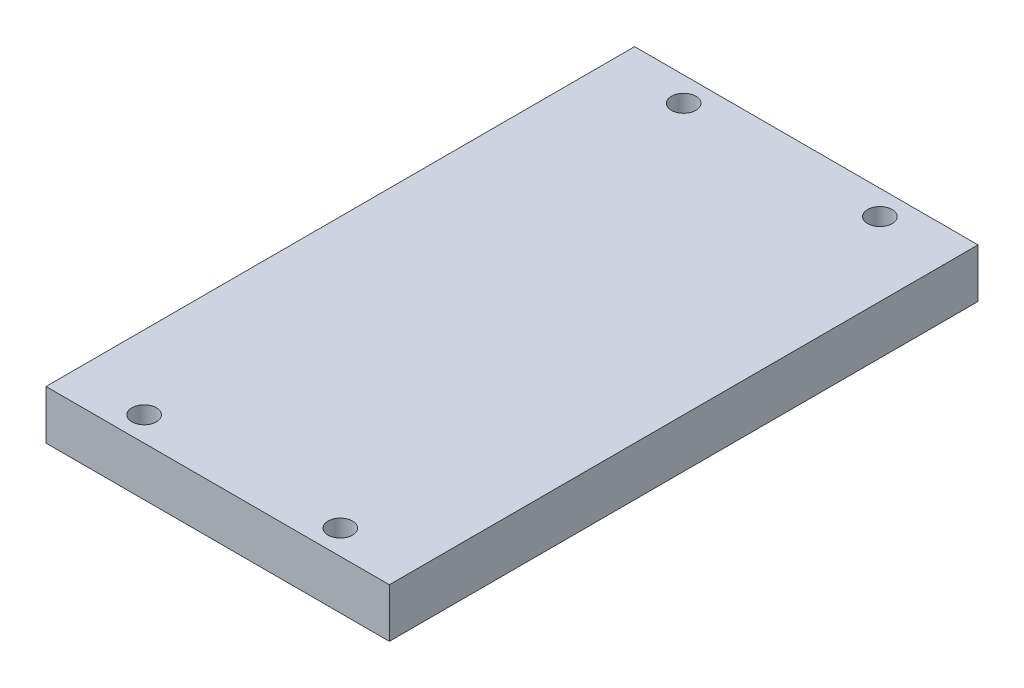
ISO-10303-21;
HEADER;
FILE_DESCRIPTION(('STEP AP214'),'2;1');
FILE_NAME('part.step','',(''),(''),'','','');
FILE_SCHEMA(('AUTOMOTIVE_DESIGN { 1 0 10303 214 1 1 1 1 }'));
ENDSEC;
DATA;
#1=APPLICATION_CONTEXT('core data for automotive mechanical design processes');
#2=APPLICATION_PROTOCOL_DEFINITION('international standard','automotive_design',2000,#1);
#3=PRODUCT_CONTEXT('',#1,'mechanical');
#4=PRODUCT('Part','Part','',(#3));
#5=PRODUCT_RELATED_PRODUCT_CATEGORY('part','',(#4));
#6=PRODUCT_DEFINITION_FORMATION('','',#4);
#7=PRODUCT_DEFINITION_CONTEXT('part definition',#1,'design');
#8=PRODUCT_DEFINITION('design','',#6,#7);
#9=PRODUCT_DEFINITION_SHAPE('','',#8);
#10=(LENGTH_UNIT() NAMED_UNIT(*) SI_UNIT(.MILLI.,.METRE.));
#11=(NAMED_UNIT(*) PLANE_ANGLE_UNIT() SI_UNIT($,.RADIAN.));
#12=(NAMED_UNIT(*) SI_UNIT($,.STERADIAN.) SOLID_ANGLE_UNIT());
#13=UNCERTAINTY_MEASURE_WITH_UNIT(LENGTH_MEASURE(1.E-05),#10,'distance_accuracy_value','');
#14=(GEOMETRIC_REPRESENTATION_CONTEXT(3) GLOBAL_UNCERTAINTY_ASSIGNED_CONTEXT((#13)) GLOBAL_UNIT_ASSIGNED_CONTEXT((#10,
#11,#12)) REPRESENTATION_CONTEXT('',''));
#15=CARTESIAN_POINT('',(0.,0.,0.));
#16=DIRECTION('',(0.,0.,1.));
#17=DIRECTION('',(1.,0.,0.));
#18=AXIS2_PLACEMENT_3D('',#15,#16,#17);
#19=CARTESIAN_POINT('',(21.,6.,-36.));
#20=DIRECTION('',(-1.,0.,0.));
#21=DIRECTION('',(0.,0.,1.));
#22=AXIS2_PLACEMENT_3D('',#19,#20,#21);
#23=PLANE('',#22);
#24=DIRECTION('',(0.,0.,-1.));
#25=VECTOR('',#24,1.);
#26=CARTESIAN_POINT('',(21.,0.,-36.));
#27=LINE('',#26,#25);
#28=CARTESIAN_POINT('',(21.,0.,36.));
#29=VERTEX_POINT('',#28);
#30=CARTESIAN_POINT('',(21.,0.,-36.));
#31=VERTEX_POINT('',#30);
#32=EDGE_CURVE('E98',#29,#31,#27,.T.);
#33=ORIENTED_EDGE('',*,*,#32,.T.);
#34=DIRECTION('',(0.,-1.,0.));
#35=VECTOR('',#34,1.);
#36=CARTESIAN_POINT('',(21.,6.,-36.));
#37=LINE('',#36,#35);
#38=CARTESIAN_POINT('',(21.,6.,-36.));
#39=VERTEX_POINT('',#38);
#40=EDGE_CURVE('E11',#39,#31,#37,.T.);
#41=ORIENTED_EDGE('',*,*,#40,.F.);
#42=DIRECTION('',(0.,0.,-1.));
#43=VECTOR('',#42,1.);
#44=CARTESIAN_POINT('',(21.,6.,-36.));
#45=LINE('',#44,#43);
#46=CARTESIAN_POINT('',(21.,6.,36.));
#47=VERTEX_POINT('',#46);
#48=EDGE_CURVE('E85',#47,#39,#45,.T.);
#49=ORIENTED_EDGE('',*,*,#48,.F.);
#50=DIRECTION('',(0.,-1.,0.));
#51=VECTOR('',#50,1.);
#52=CARTESIAN_POINT('',(21.,6.,36.));
#53=LINE('',#52,#51);
#54=EDGE_CURVE('E94',#47,#29,#53,.T.);
#55=ORIENTED_EDGE('',*,*,#54,.T.);
#56=EDGE_LOOP('',(#33,#41,#49,#55));
#57=FACE_BOUND('',#56,.T.);
#58=ADVANCED_FACE('F32',(#57),#23,.F.);
#59=CARTESIAN_POINT('',(-21.,6.,-36.));
#60=DIRECTION('',(0.,0.,1.));
#61=DIRECTION('',(1.,0.,0.));
#62=AXIS2_PLACEMENT_3D('',#59,#60,#61);
#63=PLANE('',#62);
#64=DIRECTION('',(-1.,0.,0.));
#65=VECTOR('',#64,1.);
#66=CARTESIAN_POINT('',(-21.,0.,-36.));
#67=LINE('',#66,#65);
#68=CARTESIAN_POINT('',(-21.,0.,-36.));
#69=VERTEX_POINT('',#68);
#70=EDGE_CURVE('E89',#31,#69,#67,.T.);
#71=ORIENTED_EDGE('',*,*,#70,.T.);
#72=DIRECTION('',(0.,-1.,0.));
#73=VECTOR('',#72,1.);
#74=CARTESIAN_POINT('',(-21.,6.,-36.));
#75=LINE('',#74,#73);
#76=CARTESIAN_POINT('',(-21.,6.,-36.));
#77=VERTEX_POINT('',#76);
#78=EDGE_CURVE('E41',#77,#69,#75,.T.);
#79=ORIENTED_EDGE('',*,*,#78,.F.);
#80=DIRECTION('',(-1.,0.,0.));
#81=VECTOR('',#80,1.);
#82=CARTESIAN_POINT('',(-21.,6.,-36.));
#83=LINE('',#82,#81);
#84=EDGE_CURVE('E80',#39,#77,#83,.T.);
#85=ORIENTED_EDGE('',*,*,#84,.F.);
#86=ORIENTED_EDGE('',*,*,#40,.T.);
#87=EDGE_LOOP('',(#71,#79,#85,#86));
#88=FACE_BOUND('',#87,.T.);
#89=ADVANCED_FACE('F88',(#88),#63,.F.);
#90=CARTESIAN_POINT('',(-21.,6.,-36.));
#91=DIRECTION('',(1.,0.,0.));
#92=DIRECTION('',(0.,0.,-1.));
#93=AXIS2_PLACEMENT_3D('',#90,#91,#92);
#94=PLANE('',#93);
#95=DIRECTION('',(0.,0.,1.));
#96=VECTOR('',#95,1.);
#97=CARTESIAN_POINT('',(-21.,0.,-36.));
#98=LINE('',#97,#96);
#99=CARTESIAN_POINT('',(-21.,0.,36.));
#100=VERTEX_POINT('',#99);
#101=EDGE_CURVE('E67',#69,#100,#98,.T.);
#102=ORIENTED_EDGE('',*,*,#101,.T.);
#103=DIRECTION('',(0.,-1.,0.));
#104=VECTOR('',#103,1.);
#105=CARTESIAN_POINT('',(-21.,6.,36.));
#106=LINE('',#105,#104);
#107=CARTESIAN_POINT('',(-21.,6.,36.));
#108=VERTEX_POINT('',#107);
#109=EDGE_CURVE('E90',#108,#100,#106,.T.);
#110=ORIENTED_EDGE('',*,*,#109,.F.);
#111=DIRECTION('',(0.,0.,1.));
#112=VECTOR('',#111,1.);
#113=CARTESIAN_POINT('',(-21.,6.,-36.));
#114=LINE('',#113,#112);
#115=EDGE_CURVE('E83',#77,#108,#114,.T.);
#116=ORIENTED_EDGE('',*,*,#115,.F.);
#117=ORIENTED_EDGE('',*,*,#78,.T.);
#118=EDGE_LOOP('',(#102,#110,#116,#117));
#119=FACE_BOUND('',#118,.T.);
#120=ADVANCED_FACE('F92',(#119),#94,.F.);
#121=CARTESIAN_POINT('',(-21.,6.,36.));
#122=DIRECTION('',(0.,0.,-1.));
#123=DIRECTION('',(-1.,0.,0.));
#124=AXIS2_PLACEMENT_3D('',#121,#122,#123);
#125=PLANE('',#124);
#126=DIRECTION('',(1.,0.,0.));
#127=VECTOR('',#126,1.);
#128=CARTESIAN_POINT('',(-21.,0.,36.));
#129=LINE('',#128,#127);
#130=EDGE_CURVE('E73',#100,#29,#129,.T.);
#131=ORIENTED_EDGE('',*,*,#130,.T.);
#132=ORIENTED_EDGE('',*,*,#54,.F.);
#133=DIRECTION('',(1.,0.,0.));
#134=VECTOR('',#133,1.);
#135=CARTESIAN_POINT('',(-21.,6.,36.));
#136=LINE('',#135,#134);
#137=EDGE_CURVE('E50',#108,#47,#136,.T.);
#138=ORIENTED_EDGE('',*,*,#137,.F.);
#139=ORIENTED_EDGE('',*,*,#109,.T.);
#140=EDGE_LOOP('',(#131,#132,#138,#139));
#141=FACE_BOUND('',#140,.T.);
#142=ADVANCED_FACE('F150',(#141),#125,.F.);
#143=CARTESIAN_POINT('',(0.,6.,0.));
#144=DIRECTION('',(0.,1.,0.));
#145=DIRECTION('',(0.,0.,1.));
#146=AXIS2_PLACEMENT_3D('',#143,#144,#145);
#147=PLANE('',#146);
#148=CARTESIAN_POINT('',(-12.,6.,-33.));
#149=DIRECTION('',(0.,1.,0.));
#150=DIRECTION('',(0.,0.,-1.));
#151=AXIS2_PLACEMENT_3D('',#148,#149,#150);
#152=CIRCLE('',#151,1.5);
#153=CARTESIAN_POINT('',(-12.,6.,-34.5));
#154=VERTEX_POINT('',#153);
#155=EDGE_CURVE('E216',#154,#154,#152,.T.);
#156=ORIENTED_EDGE('',*,*,#155,.F.);
#157=EDGE_LOOP('',(#156));
#158=FACE_BOUND('',#157,.T.);
#159=CARTESIAN_POINT('',(12.,6.,-33.));
#160=DIRECTION('',(0.,1.,0.));
#161=DIRECTION('',(0.,0.,1.));
#162=AXIS2_PLACEMENT_3D('',#159,#160,#161);
#163=CIRCLE('',#162,1.5);
#164=CARTESIAN_POINT('',(12.,6.,-31.5));
#165=VERTEX_POINT('',#164);
#166=EDGE_CURVE('E211',#165,#165,#163,.T.);
#167=ORIENTED_EDGE('',*,*,#166,.F.);
#168=EDGE_LOOP('',(#167));
#169=FACE_BOUND('',#168,.T.);
#170=CARTESIAN_POINT('',(12.,6.,33.));
#171=DIRECTION('',(0.,1.,0.));
#172=DIRECTION('',(0.,0.,-1.));
#173=AXIS2_PLACEMENT_3D('',#170,#171,#172);
#174=CIRCLE('',#173,1.5);
#175=CARTESIAN_POINT('',(12.,6.,31.5));
#176=VERTEX_POINT('',#175);
#177=EDGE_CURVE('E204',#176,#176,#174,.T.);
#178=ORIENTED_EDGE('',*,*,#177,.F.);
#179=EDGE_LOOP('',(#178));
#180=FACE_BOUND('',#179,.T.);
#181=CARTESIAN_POINT('',(-12.,6.,33.));
#182=DIRECTION('',(0.,1.,0.));
#183=DIRECTION('',(0.,0.,1.));
#184=AXIS2_PLACEMENT_3D('',#181,#182,#183);
#185=CIRCLE('',#184,1.5);
#186=CARTESIAN_POINT('',(-12.,6.,34.5));
#187=VERTEX_POINT('',#186);
#188=EDGE_CURVE('E110',#187,#187,#185,.T.);
#189=ORIENTED_EDGE('',*,*,#188,.F.);
#190=EDGE_LOOP('',(#189));
#191=FACE_BOUND('',#190,.T.);
#192=ORIENTED_EDGE('',*,*,#48,.T.);
#193=ORIENTED_EDGE('',*,*,#84,.T.);
#194=ORIENTED_EDGE('',*,*,#115,.T.);
#195=ORIENTED_EDGE('',*,*,#137,.T.);
#196=EDGE_LOOP('',(#192,#193,#194,#195));
#197=FACE_BOUND('',#196,.T.);
#198=ADVANCED_FACE('F81',(#158,#169,#180,#191,#197),#147,.T.);
#199=CARTESIAN_POINT('',(0.,0.,0.));
#200=DIRECTION('',(0.,1.,0.));
#201=DIRECTION('',(0.,0.,1.));
#202=AXIS2_PLACEMENT_3D('',#199,#200,#201);
#203=PLANE('',#202);
#204=CARTESIAN_POINT('',(-12.,0.,-33.));
#205=DIRECTION('',(0.,1.,0.));
#206=DIRECTION('',(0.,0.,1.));
#207=AXIS2_PLACEMENT_3D('',#204,#205,#206);
#208=CIRCLE('',#207,1.5);
#209=CARTESIAN_POINT('',(-12.,0.,-31.5));
#210=VERTEX_POINT('',#209);
#211=EDGE_CURVE('E35',#210,#210,#208,.T.);
#212=ORIENTED_EDGE('',*,*,#211,.T.);
#213=EDGE_LOOP('',(#212));
#214=FACE_BOUND('',#213,.T.);
#215=CARTESIAN_POINT('',(12.,0.,-33.));
#216=DIRECTION('',(0.,1.,0.));
#217=DIRECTION('',(0.,0.,1.));
#218=AXIS2_PLACEMENT_3D('',#215,#216,#217);
#219=CIRCLE('',#218,1.5);
#220=CARTESIAN_POINT('',(12.,0.,-31.5));
#221=VERTEX_POINT('',#220);
#222=EDGE_CURVE('E112',#221,#221,#219,.T.);
#223=ORIENTED_EDGE('',*,*,#222,.T.);
#224=EDGE_LOOP('',(#223));
#225=FACE_BOUND('',#224,.T.);
#226=CARTESIAN_POINT('',(12.,0.,33.));
#227=DIRECTION('',(0.,1.,0.));
#228=DIRECTION('',(0.,0.,1.));
#229=AXIS2_PLACEMENT_3D('',#226,#227,#228);
#230=CIRCLE('',#229,1.5);
#231=CARTESIAN_POINT('',(12.,0.,34.5));
#232=VERTEX_POINT('',#231);
#233=EDGE_CURVE('E109',#232,#232,#230,.T.);
#234=ORIENTED_EDGE('',*,*,#233,.T.);
#235=EDGE_LOOP('',(#234));
#236=FACE_BOUND('',#235,.T.);
#237=CARTESIAN_POINT('',(-12.,0.,33.));
#238=DIRECTION('',(0.,1.,0.));
#239=DIRECTION('',(0.,0.,1.));
#240=AXIS2_PLACEMENT_3D('',#237,#238,#239);
#241=CIRCLE('',#240,1.5);
#242=CARTESIAN_POINT('',(-12.,0.,34.5));
#243=VERTEX_POINT('',#242);
#244=EDGE_CURVE('E106',#243,#243,#241,.T.);
#245=ORIENTED_EDGE('',*,*,#244,.T.);
#246=EDGE_LOOP('',(#245));
#247=FACE_BOUND('',#246,.T.);
#248=ORIENTED_EDGE('',*,*,#32,.F.);
#249=ORIENTED_EDGE('',*,*,#130,.F.);
#250=ORIENTED_EDGE('',*,*,#101,.F.);
#251=ORIENTED_EDGE('',*,*,#70,.F.);
#252=EDGE_LOOP('',(#248,#249,#250,#251));
#253=FACE_BOUND('',#252,.T.);
#254=ADVANCED_FACE('F119',(#214,#225,#236,#247,#253),#203,.F.);
#255=CARTESIAN_POINT('',(-12.,-4.,33.));
#256=DIRECTION('',(0.,1.,0.));
#257=DIRECTION('',(0.,0.,1.));
#258=AXIS2_PLACEMENT_3D('',#255,#256,#257);
#259=CYLINDRICAL_SURFACE('',#258,1.5);
#260=ORIENTED_EDGE('',*,*,#188,.T.);
#261=EDGE_LOOP('',(#260));
#262=FACE_BOUND('',#261,.T.);
#263=ORIENTED_EDGE('',*,*,#244,.F.);
#264=EDGE_LOOP('',(#263));
#265=FACE_BOUND('',#264,.T.);
#266=ADVANCED_FACE('F142',(#262,#265),#259,.F.);
#267=CARTESIAN_POINT('',(12.,-4.,33.));
#268=DIRECTION('',(0.,1.,0.));
#269=DIRECTION('',(0.,0.,1.));
#270=AXIS2_PLACEMENT_3D('',#267,#268,#269);
#271=CYLINDRICAL_SURFACE('',#270,1.5);
#272=ORIENTED_EDGE('',*,*,#177,.T.);
#273=EDGE_LOOP('',(#272));
#274=FACE_BOUND('',#273,.T.);
#275=ORIENTED_EDGE('',*,*,#233,.F.);
#276=EDGE_LOOP('',(#275));
#277=FACE_BOUND('',#276,.T.);
#278=ADVANCED_FACE('F129',(#274,#277),#271,.F.);
#279=CARTESIAN_POINT('',(12.,-4.,-33.));
#280=DIRECTION('',(0.,1.,0.));
#281=DIRECTION('',(0.,0.,1.));
#282=AXIS2_PLACEMENT_3D('',#279,#280,#281);
#283=CYLINDRICAL_SURFACE('',#282,1.5);
#284=ORIENTED_EDGE('',*,*,#166,.T.);
#285=EDGE_LOOP('',(#284));
#286=FACE_BOUND('',#285,.T.);
#287=ORIENTED_EDGE('',*,*,#222,.F.);
#288=EDGE_LOOP('',(#287));
#289=FACE_BOUND('',#288,.T.);
#290=ADVANCED_FACE('F123',(#286,#289),#283,.F.);
#291=CARTESIAN_POINT('',(-12.,-4.,-33.));
#292=DIRECTION('',(0.,1.,0.));
#293=DIRECTION('',(0.,0.,1.));
#294=AXIS2_PLACEMENT_3D('',#291,#292,#293);
#295=CYLINDRICAL_SURFACE('',#294,1.5);
#296=ORIENTED_EDGE('',*,*,#155,.T.);
#297=EDGE_LOOP('',(#296));
#298=FACE_BOUND('',#297,.T.);
#299=ORIENTED_EDGE('',*,*,#211,.F.);
#300=EDGE_LOOP('',(#299));
#301=FACE_BOUND('',#300,.T.);
#302=ADVANCED_FACE('F121',(#298,#301),#295,.F.);
#303=CLOSED_SHELL('',(#58,#89,#120,#142,#198,#254,#266,#278,#290,#302));
#304=MANIFOLD_SOLID_BREP('B2',#303);
#305=ADVANCED_BREP_SHAPE_REPRESENTATION('',(#18,#304),#14);
#306=SHAPE_DEFINITION_REPRESENTATION(#9,#305);
ENDSEC;
END-ISO-10303-21;
